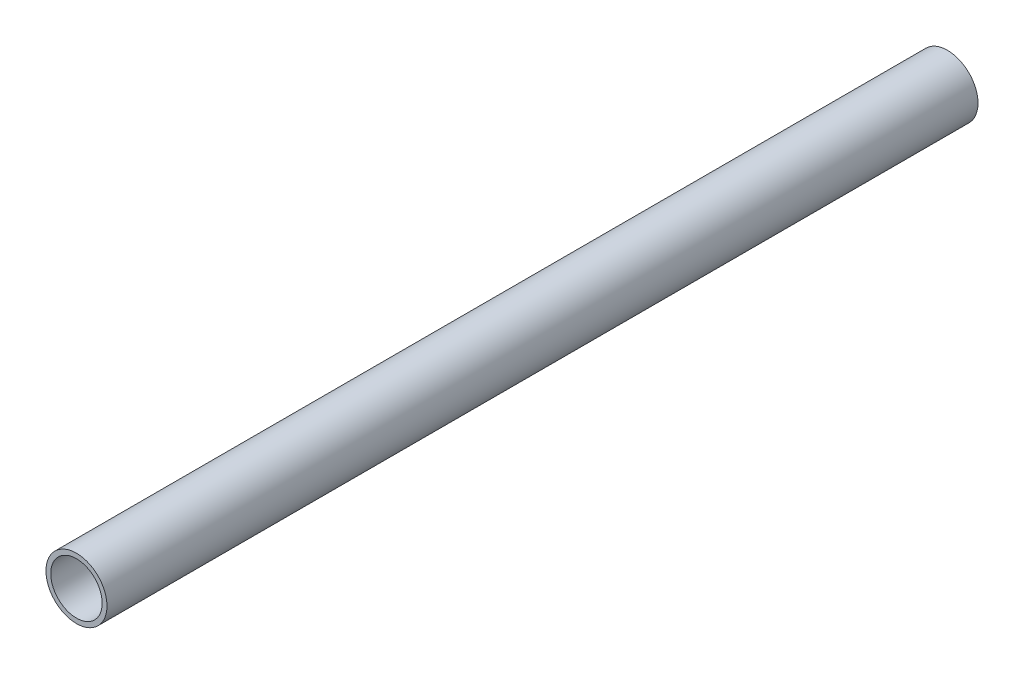
ISO-10303-21;
HEADER;
FILE_DESCRIPTION(('STEP AP214'),'2;1');
FILE_NAME('part.step','',(''),(''),'','','');
FILE_SCHEMA(('AUTOMOTIVE_DESIGN { 1 0 10303 214 1 1 1 1 }'));
ENDSEC;
DATA;
#1=APPLICATION_CONTEXT('core data for automotive mechanical design processes');
#2=APPLICATION_PROTOCOL_DEFINITION('international standard','automotive_design',2000,#1);
#3=PRODUCT_CONTEXT('',#1,'mechanical');
#4=PRODUCT('Part','Part','',(#3));
#5=PRODUCT_RELATED_PRODUCT_CATEGORY('part','',(#4));
#6=PRODUCT_DEFINITION_FORMATION('','',#4);
#7=PRODUCT_DEFINITION_CONTEXT('part definition',#1,'design');
#8=PRODUCT_DEFINITION('design','',#6,#7);
#9=PRODUCT_DEFINITION_SHAPE('','',#8);
#10=(LENGTH_UNIT() NAMED_UNIT(*) SI_UNIT(.MILLI.,.METRE.));
#11=(NAMED_UNIT(*) PLANE_ANGLE_UNIT() SI_UNIT($,.RADIAN.));
#12=(NAMED_UNIT(*) SI_UNIT($,.STERADIAN.) SOLID_ANGLE_UNIT());
#13=UNCERTAINTY_MEASURE_WITH_UNIT(LENGTH_MEASURE(1.E-05),#10,'distance_accuracy_value','');
#14=(GEOMETRIC_REPRESENTATION_CONTEXT(3) GLOBAL_UNCERTAINTY_ASSIGNED_CONTEXT((#13)) GLOBAL_UNIT_ASSIGNED_CONTEXT((#10,
#11,#12)) REPRESENTATION_CONTEXT('',''));
#15=CARTESIAN_POINT('',(0.,0.,0.));
#16=DIRECTION('',(0.,0.,1.));
#17=DIRECTION('',(1.,0.,0.));
#18=AXIS2_PLACEMENT_3D('',#15,#16,#17);
#19=CARTESIAN_POINT('',(0.,0.,113.296195937));
#20=DIRECTION('',(0.,0.,1.));
#21=DIRECTION('',(1.,0.,0.));
#22=AXIS2_PLACEMENT_3D('',#19,#20,#21);
#23=PLANE('',#22);
#24=CARTESIAN_POINT('',(0.,0.,113.296195937));
#25=DIRECTION('',(0.,0.,1.));
#26=DIRECTION('',(1.,0.,0.));
#27=AXIS2_PLACEMENT_3D('',#24,#25,#26);
#28=CIRCLE('',#27,7.9375);
#29=CARTESIAN_POINT('',(7.9375,0.,113.296195937));
#30=VERTEX_POINT('',#29);
#31=EDGE_CURVE('E10',#30,#30,#28,.T.);
#32=ORIENTED_EDGE('',*,*,#31,.T.);
#33=EDGE_LOOP('',(#32));
#34=FACE_BOUND('',#33,.T.);
#35=CARTESIAN_POINT('',(0.,0.,113.296195937));
#36=DIRECTION('',(0.,0.,1.));
#37=DIRECTION('',(1.,0.,0.));
#38=AXIS2_PLACEMENT_3D('',#35,#36,#37);
#39=CIRCLE('',#38,6.6929);
#40=CARTESIAN_POINT('',(6.6929,0.,113.296195937));
#41=VERTEX_POINT('',#40);
#42=EDGE_CURVE('E54',#41,#41,#39,.T.);
#43=ORIENTED_EDGE('',*,*,#42,.F.);
#44=EDGE_LOOP('',(#43));
#45=FACE_BOUND('',#44,.T.);
#46=ADVANCED_FACE('F43',(#34,#45),#23,.T.);
#47=CARTESIAN_POINT('',(0.,0.,-113.296195937));
#48=DIRECTION('',(0.,0.,1.));
#49=DIRECTION('',(1.,0.,0.));
#50=AXIS2_PLACEMENT_3D('',#47,#48,#49);
#51=PLANE('',#50);
#52=CARTESIAN_POINT('',(0.,0.,-113.296195937));
#53=DIRECTION('',(0.,0.,1.));
#54=DIRECTION('',(1.,0.,0.));
#55=AXIS2_PLACEMENT_3D('',#52,#53,#54);
#56=CIRCLE('',#55,7.9375);
#57=CARTESIAN_POINT('',(7.9375,0.,-113.296195937));
#58=VERTEX_POINT('',#57);
#59=EDGE_CURVE('E47',#58,#58,#56,.T.);
#60=ORIENTED_EDGE('',*,*,#59,.F.);
#61=EDGE_LOOP('',(#60));
#62=FACE_BOUND('',#61,.T.);
#63=CARTESIAN_POINT('',(0.,0.,-113.296195937));
#64=DIRECTION('',(0.,0.,1.));
#65=DIRECTION('',(1.,0.,0.));
#66=AXIS2_PLACEMENT_3D('',#63,#64,#65);
#67=CIRCLE('',#66,6.6929);
#68=CARTESIAN_POINT('',(6.6929,0.,-113.296195937));
#69=VERTEX_POINT('',#68);
#70=EDGE_CURVE('E56',#69,#69,#67,.T.);
#71=ORIENTED_EDGE('',*,*,#70,.T.);
#72=EDGE_LOOP('',(#71));
#73=FACE_BOUND('',#72,.T.);
#74=ADVANCED_FACE('F66',(#62,#73),#51,.F.);
#75=CARTESIAN_POINT('',(0.,0.,113.296195937));
#76=DIRECTION('',(0.,0.,-1.));
#77=DIRECTION('',(-1.,0.,0.));
#78=AXIS2_PLACEMENT_3D('',#75,#76,#77);
#79=CYLINDRICAL_SURFACE('',#78,7.9375);
#80=ORIENTED_EDGE('',*,*,#31,.F.);
#81=EDGE_LOOP('',(#80));
#82=FACE_BOUND('',#81,.T.);
#83=ORIENTED_EDGE('',*,*,#59,.T.);
#84=EDGE_LOOP('',(#83));
#85=FACE_BOUND('',#84,.T.);
#86=ADVANCED_FACE('F45',(#82,#85),#79,.T.);
#87=CARTESIAN_POINT('',(0.,0.,113.296195937));
#88=DIRECTION('',(0.,0.,-1.));
#89=DIRECTION('',(-1.,0.,0.));
#90=AXIS2_PLACEMENT_3D('',#87,#88,#89);
#91=CYLINDRICAL_SURFACE('',#90,6.6929);
#92=ORIENTED_EDGE('',*,*,#42,.T.);
#93=EDGE_LOOP('',(#92));
#94=FACE_BOUND('',#93,.T.);
#95=ORIENTED_EDGE('',*,*,#70,.F.);
#96=EDGE_LOOP('',(#95));
#97=FACE_BOUND('',#96,.T.);
#98=ADVANCED_FACE('F62',(#94,#97),#91,.F.);
#99=CLOSED_SHELL('',(#46,#74,#86,#98));
#100=MANIFOLD_SOLID_BREP('B2',#99);
#101=ADVANCED_BREP_SHAPE_REPRESENTATION('',(#18,#100),#14);
#102=SHAPE_DEFINITION_REPRESENTATION(#9,#101);
ENDSEC;
END-ISO-10303-21;
